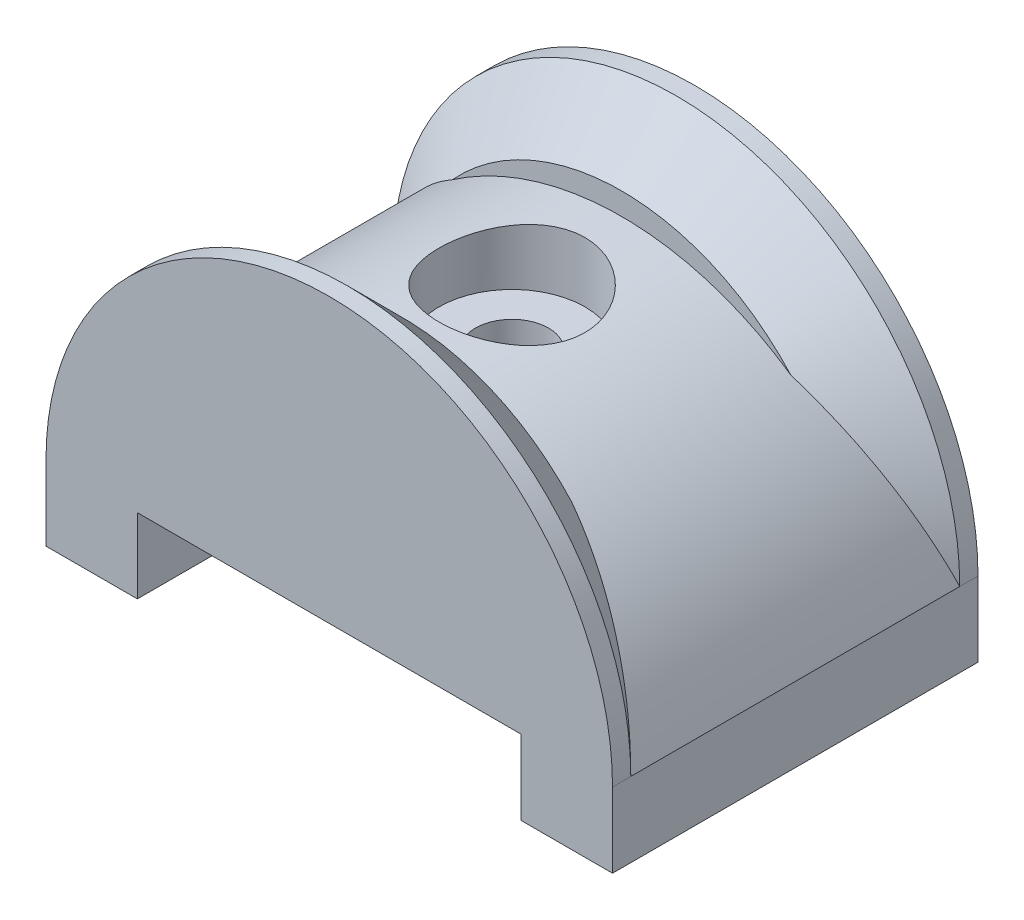
ISO-10303-21;
HEADER;
FILE_DESCRIPTION(('STEP AP214'),'2;1');
FILE_NAME('part.step','',(''),(''),'','','');
FILE_SCHEMA(('AUTOMOTIVE_DESIGN { 1 0 10303 214 1 1 1 1 }'));
ENDSEC;
DATA;
#1=APPLICATION_CONTEXT('core data for automotive mechanical design processes');
#2=APPLICATION_PROTOCOL_DEFINITION('international standard','automotive_design',2000,#1);
#3=PRODUCT_CONTEXT('',#1,'mechanical');
#4=PRODUCT('Part','Part','',(#3));
#5=PRODUCT_RELATED_PRODUCT_CATEGORY('part','',(#4));
#6=PRODUCT_DEFINITION_FORMATION('','',#4);
#7=PRODUCT_DEFINITION_CONTEXT('part definition',#1,'design');
#8=PRODUCT_DEFINITION('design','',#6,#7);
#9=PRODUCT_DEFINITION_SHAPE('','',#8);
#10=(LENGTH_UNIT() NAMED_UNIT(*) SI_UNIT(.MILLI.,.METRE.));
#11=(NAMED_UNIT(*) PLANE_ANGLE_UNIT() SI_UNIT($,.RADIAN.));
#12=(NAMED_UNIT(*) SI_UNIT($,.STERADIAN.) SOLID_ANGLE_UNIT());
#13=UNCERTAINTY_MEASURE_WITH_UNIT(LENGTH_MEASURE(1.E-05),#10,'distance_accuracy_value','');
#14=(GEOMETRIC_REPRESENTATION_CONTEXT(3) GLOBAL_UNCERTAINTY_ASSIGNED_CONTEXT((#13)) GLOBAL_UNIT_ASSIGNED_CONTEXT((#10,
#11,#12)) REPRESENTATION_CONTEXT('',''));
#15=CARTESIAN_POINT('',(0.,0.,0.));
#16=DIRECTION('',(0.,0.,1.));
#17=DIRECTION('',(1.,0.,0.));
#18=AXIS2_PLACEMENT_3D('',#15,#16,#17);
#19=CARTESIAN_POINT('',(1.09097462514418,0.,20.));
#20=DIRECTION('',(0.,0.,-1.));
#21=DIRECTION('',(-1.,0.,0.));
#22=AXIS2_PLACEMENT_3D('',#19,#20,#21);
#23=CYLINDRICAL_SURFACE('',#22,15.5);
#24=DIRECTION('',(0.,0.,-1.));
#25=VECTOR('',#24,1.);
#26=CARTESIAN_POINT('',(16.5909746251442,0.,20.));
#27=LINE('',#26,#25);
#28=CARTESIAN_POINT('',(16.5909746251442,0.,20.));
#29=VERTEX_POINT('',#28);
#30=CARTESIAN_POINT('',(16.5909746251442,0.,19.));
#31=VERTEX_POINT('',#30);
#32=EDGE_CURVE('E196',#29,#31,#27,.T.);
#33=ORIENTED_EDGE('',*,*,#32,.T.);
#34=CARTESIAN_POINT('',(1.09097462514418,0.,19.));
#35=DIRECTION('',(0.,0.,-1.));
#36=DIRECTION('',(-1.,0.,0.));
#37=AXIS2_PLACEMENT_3D('',#34,#35,#36);
#38=CIRCLE('',#37,15.5);
#39=CARTESIAN_POINT('',(-14.4090253748558,0.,19.));
#40=VERTEX_POINT('',#39);
#41=EDGE_CURVE('E138',#31,#40,#38,.F.);
#42=ORIENTED_EDGE('',*,*,#41,.T.);
#43=DIRECTION('',(0.,0.,-1.));
#44=VECTOR('',#43,1.);
#45=CARTESIAN_POINT('',(-14.4090253748558,0.,20.));
#46=LINE('',#45,#44);
#47=CARTESIAN_POINT('',(-14.4090253748558,0.,20.));
#48=VERTEX_POINT('',#47);
#49=EDGE_CURVE('E131',#48,#40,#46,.T.);
#50=ORIENTED_EDGE('',*,*,#49,.F.);
#51=CARTESIAN_POINT('',(1.09097462514418,0.,20.));
#52=DIRECTION('',(0.,0.,1.));
#53=DIRECTION('',(1.,0.,0.));
#54=AXIS2_PLACEMENT_3D('',#51,#52,#53);
#55=CIRCLE('',#54,15.5);
#56=EDGE_CURVE('E135',#48,#29,#55,.F.);
#57=ORIENTED_EDGE('',*,*,#56,.T.);
#58=EDGE_LOOP('',(#33,#42,#50,#57));
#59=FACE_BOUND('',#58,.T.);
#60=ADVANCED_FACE('F35',(#59),#23,.T.);
#61=CARTESIAN_POINT('',(-14.4090253748558,0.,0.999999999999997));
#62=VERTEX_POINT('',#61);
#63=CARTESIAN_POINT('',(-14.4090253748558,0.,0.));
#64=VERTEX_POINT('',#63);
#65=EDGE_CURVE('E144',#62,#64,#46,.T.);
#66=ORIENTED_EDGE('',*,*,#65,.F.);
#67=CARTESIAN_POINT('',(1.09097462514418,0.,0.999999999999997));
#68=DIRECTION('',(0.,0.,-1.));
#69=DIRECTION('',(-1.,0.,0.));
#70=AXIS2_PLACEMENT_3D('',#67,#68,#69);
#71=CIRCLE('',#70,15.5);
#72=CARTESIAN_POINT('',(16.5909746251442,0.,0.999999999999997));
#73=VERTEX_POINT('',#72);
#74=EDGE_CURVE('E214',#62,#73,#71,.T.);
#75=ORIENTED_EDGE('',*,*,#74,.T.);
#76=CARTESIAN_POINT('',(16.5909746251442,0.,0.));
#77=VERTEX_POINT('',#76);
#78=EDGE_CURVE('E177',#73,#77,#27,.T.);
#79=ORIENTED_EDGE('',*,*,#78,.T.);
#80=CARTESIAN_POINT('',(1.09097462514418,0.,0.));
#81=DIRECTION('',(0.,0.,1.));
#82=DIRECTION('',(1.,0.,0.));
#83=AXIS2_PLACEMENT_3D('',#80,#81,#82);
#84=CIRCLE('',#83,15.5);
#85=EDGE_CURVE('E178',#64,#77,#84,.F.);
#86=ORIENTED_EDGE('',*,*,#85,.F.);
#87=EDGE_LOOP('',(#66,#75,#79,#86));
#88=FACE_BOUND('',#87,.T.);
#89=ADVANCED_FACE('F239',(#88),#23,.T.);
#90=CARTESIAN_POINT('',(-14.4090253748558,0.,20.));
#91=DIRECTION('',(1.,0.,0.));
#92=DIRECTION('',(0.,0.,-1.));
#93=AXIS2_PLACEMENT_3D('',#90,#91,#92);
#94=PLANE('',#93);
#95=DIRECTION('',(0.,-1.,0.));
#96=VECTOR('',#95,1.);
#97=CARTESIAN_POINT('',(-14.4090253748558,0.,0.));
#98=LINE('',#97,#96);
#99=CARTESIAN_POINT('',(-14.4090253748558,-4.08823529411765,0.));
#100=VERTEX_POINT('',#99);
#101=EDGE_CURVE('E181',#64,#100,#98,.T.);
#102=ORIENTED_EDGE('',*,*,#101,.T.);
#103=DIRECTION('',(0.,0.,-1.));
#104=VECTOR('',#103,1.);
#105=CARTESIAN_POINT('',(-14.4090253748558,-4.08823529411765,20.));
#106=LINE('',#105,#104);
#107=CARTESIAN_POINT('',(-14.4090253748558,-4.08823529411765,20.));
#108=VERTEX_POINT('',#107);
#109=EDGE_CURVE('E149',#108,#100,#106,.T.);
#110=ORIENTED_EDGE('',*,*,#109,.F.);
#111=DIRECTION('',(0.,-1.,0.));
#112=VECTOR('',#111,1.);
#113=CARTESIAN_POINT('',(-14.4090253748558,0.,20.));
#114=LINE('',#113,#112);
#115=EDGE_CURVE('E146',#48,#108,#114,.T.);
#116=ORIENTED_EDGE('',*,*,#115,.F.);
#117=ORIENTED_EDGE('',*,*,#49,.T.);
#118=EDGE_CURVE('E142',#40,#62,#46,.T.);
#119=ORIENTED_EDGE('',*,*,#118,.T.);
#120=ORIENTED_EDGE('',*,*,#65,.T.);
#121=EDGE_LOOP('',(#102,#110,#116,#117,#119,#120));
#122=FACE_BOUND('',#121,.T.);
#123=ADVANCED_FACE('F147',(#122),#94,.F.);
#124=CARTESIAN_POINT('',(0.,-4.08823529411765,20.));
#125=DIRECTION('',(0.,1.,0.));
#126=DIRECTION('',(0.,0.,1.));
#127=AXIS2_PLACEMENT_3D('',#124,#125,#126);
#128=PLANE('',#127);
#129=DIRECTION('',(1.,0.,0.));
#130=VECTOR('',#129,1.);
#131=CARTESIAN_POINT('',(0.,-4.08823529411765,0.));
#132=LINE('',#131,#130);
#133=CARTESIAN_POINT('',(-9.40902537485582,-4.08823529411765,0.));
#134=VERTEX_POINT('',#133);
#135=EDGE_CURVE('E184',#100,#134,#132,.T.);
#136=ORIENTED_EDGE('',*,*,#135,.T.);
#137=DIRECTION('',(0.,0.,-1.));
#138=VECTOR('',#137,1.);
#139=CARTESIAN_POINT('',(-9.40902537485582,-4.08823529411765,20.));
#140=LINE('',#139,#138);
#141=CARTESIAN_POINT('',(-9.40902537485582,-4.08823529411765,20.));
#142=VERTEX_POINT('',#141);
#143=EDGE_CURVE('E209',#142,#134,#140,.T.);
#144=ORIENTED_EDGE('',*,*,#143,.F.);
#145=DIRECTION('',(1.,0.,0.));
#146=VECTOR('',#145,1.);
#147=CARTESIAN_POINT('',(0.,-4.08823529411765,20.));
#148=LINE('',#147,#146);
#149=EDGE_CURVE('E152',#108,#142,#148,.T.);
#150=ORIENTED_EDGE('',*,*,#149,.F.);
#151=ORIENTED_EDGE('',*,*,#109,.T.);
#152=EDGE_LOOP('',(#136,#144,#150,#151));
#153=FACE_BOUND('',#152,.T.);
#154=ADVANCED_FACE('F246',(#153),#128,.F.);
#155=CARTESIAN_POINT('',(-9.40902537485582,0.,20.));
#156=DIRECTION('',(1.,0.,0.));
#157=DIRECTION('',(0.,0.,-1.));
#158=AXIS2_PLACEMENT_3D('',#155,#156,#157);
#159=PLANE('',#158);
#160=DIRECTION('',(0.,-1.,0.));
#161=VECTOR('',#160,1.);
#162=CARTESIAN_POINT('',(-9.40902537485582,0.,0.));
#163=LINE('',#162,#161);
#164=CARTESIAN_POINT('',(-9.40902537485582,0.,0.));
#165=VERTEX_POINT('',#164);
#166=EDGE_CURVE('E187',#165,#134,#163,.T.);
#167=ORIENTED_EDGE('',*,*,#166,.F.);
#168=DIRECTION('',(0.,0.,-1.));
#169=VECTOR('',#168,1.);
#170=CARTESIAN_POINT('',(-9.40902537485582,0.,20.));
#171=LINE('',#170,#169);
#172=CARTESIAN_POINT('',(-9.40902537485582,0.,20.));
#173=VERTEX_POINT('',#172);
#174=EDGE_CURVE('E207',#173,#165,#171,.T.);
#175=ORIENTED_EDGE('',*,*,#174,.F.);
#176=DIRECTION('',(0.,-1.,0.));
#177=VECTOR('',#176,1.);
#178=CARTESIAN_POINT('',(-9.40902537485582,0.,20.));
#179=LINE('',#178,#177);
#180=EDGE_CURVE('E167',#173,#142,#179,.T.);
#181=ORIENTED_EDGE('',*,*,#180,.T.);
#182=ORIENTED_EDGE('',*,*,#143,.T.);
#183=EDGE_LOOP('',(#167,#175,#181,#182));
#184=FACE_BOUND('',#183,.T.);
#185=ADVANCED_FACE('F249',(#184),#159,.T.);
#186=CARTESIAN_POINT('',(0.,0.,20.));
#187=DIRECTION('',(0.,1.,0.));
#188=DIRECTION('',(0.,0.,1.));
#189=AXIS2_PLACEMENT_3D('',#186,#187,#188);
#190=PLANE('',#189);
#191=CARTESIAN_POINT('',(1.09097462514418,0.,10.));
#192=DIRECTION('',(0.,-1.,0.));
#193=DIRECTION('',(0.,0.,-1.));
#194=AXIS2_PLACEMENT_3D('',#191,#192,#193);
#195=CIRCLE('',#194,2.);
#196=CARTESIAN_POINT('',(1.09097462514418,0.,8.));
#197=VERTEX_POINT('',#196);
#198=EDGE_CURVE('E376',#197,#197,#195,.T.);
#199=ORIENTED_EDGE('',*,*,#198,.F.);
#200=EDGE_LOOP('',(#199));
#201=FACE_BOUND('',#200,.T.);
#202=DIRECTION('',(1.,0.,0.));
#203=VECTOR('',#202,1.);
#204=CARTESIAN_POINT('',(0.,0.,0.));
#205=LINE('',#204,#203);
#206=CARTESIAN_POINT('',(11.5909746251442,0.,0.));
#207=VERTEX_POINT('',#206);
#208=EDGE_CURVE('E190',#165,#207,#205,.T.);
#209=ORIENTED_EDGE('',*,*,#208,.T.);
#210=DIRECTION('',(0.,0.,-1.));
#211=VECTOR('',#210,1.);
#212=CARTESIAN_POINT('',(11.5909746251442,0.,20.));
#213=LINE('',#212,#211);
#214=CARTESIAN_POINT('',(11.5909746251442,0.,20.));
#215=VERTEX_POINT('',#214);
#216=EDGE_CURVE('E204',#215,#207,#213,.T.);
#217=ORIENTED_EDGE('',*,*,#216,.F.);
#218=DIRECTION('',(1.,0.,0.));
#219=VECTOR('',#218,1.);
#220=CARTESIAN_POINT('',(0.,0.,20.));
#221=LINE('',#220,#219);
#222=EDGE_CURVE('E170',#173,#215,#221,.T.);
#223=ORIENTED_EDGE('',*,*,#222,.F.);
#224=ORIENTED_EDGE('',*,*,#174,.T.);
#225=EDGE_LOOP('',(#209,#217,#223,#224));
#226=FACE_BOUND('',#225,.T.);
#227=ADVANCED_FACE('F253',(#201,#226),#190,.F.);
#228=CARTESIAN_POINT('',(11.5909746251442,0.,20.));
#229=DIRECTION('',(1.,0.,0.));
#230=DIRECTION('',(0.,0.,-1.));
#231=AXIS2_PLACEMENT_3D('',#228,#229,#230);
#232=PLANE('',#231);
#233=DIRECTION('',(0.,-1.,0.));
#234=VECTOR('',#233,1.);
#235=CARTESIAN_POINT('',(11.5909746251442,0.,0.));
#236=LINE('',#235,#234);
#237=CARTESIAN_POINT('',(11.5909746251442,-4.08823529411765,0.));
#238=VERTEX_POINT('',#237);
#239=EDGE_CURVE('E192',#207,#238,#236,.T.);
#240=ORIENTED_EDGE('',*,*,#239,.T.);
#241=DIRECTION('',(0.,0.,-1.));
#242=VECTOR('',#241,1.);
#243=CARTESIAN_POINT('',(11.5909746251442,-4.08823529411765,20.));
#244=LINE('',#243,#242);
#245=CARTESIAN_POINT('',(11.5909746251442,-4.08823529411765,20.));
#246=VERTEX_POINT('',#245);
#247=EDGE_CURVE('E201',#246,#238,#244,.T.);
#248=ORIENTED_EDGE('',*,*,#247,.F.);
#249=DIRECTION('',(0.,-1.,0.));
#250=VECTOR('',#249,1.);
#251=CARTESIAN_POINT('',(11.5909746251442,0.,20.));
#252=LINE('',#251,#250);
#253=EDGE_CURVE('E172',#215,#246,#252,.T.);
#254=ORIENTED_EDGE('',*,*,#253,.F.);
#255=ORIENTED_EDGE('',*,*,#216,.T.);
#256=EDGE_LOOP('',(#240,#248,#254,#255));
#257=FACE_BOUND('',#256,.T.);
#258=ADVANCED_FACE('F257',(#257),#232,.F.);
#259=CARTESIAN_POINT('',(0.,-4.08823529411765,20.));
#260=DIRECTION('',(0.,1.,0.));
#261=DIRECTION('',(0.,0.,1.));
#262=AXIS2_PLACEMENT_3D('',#259,#260,#261);
#263=PLANE('',#262);
#264=DIRECTION('',(1.,0.,0.));
#265=VECTOR('',#264,1.);
#266=CARTESIAN_POINT('',(0.,-4.08823529411765,0.));
#267=LINE('',#266,#265);
#268=CARTESIAN_POINT('',(16.5909746251442,-4.08823529411765,0.));
#269=VERTEX_POINT('',#268);
#270=EDGE_CURVE('E160',#238,#269,#267,.T.);
#271=ORIENTED_EDGE('',*,*,#270,.T.);
#272=DIRECTION('',(0.,0.,-1.));
#273=VECTOR('',#272,1.);
#274=CARTESIAN_POINT('',(16.5909746251442,-4.08823529411765,20.));
#275=LINE('',#274,#273);
#276=CARTESIAN_POINT('',(16.5909746251442,-4.08823529411765,20.));
#277=VERTEX_POINT('',#276);
#278=EDGE_CURVE('E198',#277,#269,#275,.T.);
#279=ORIENTED_EDGE('',*,*,#278,.F.);
#280=DIRECTION('',(1.,0.,0.));
#281=VECTOR('',#280,1.);
#282=CARTESIAN_POINT('',(0.,-4.08823529411765,20.));
#283=LINE('',#282,#281);
#284=EDGE_CURVE('E174',#246,#277,#283,.T.);
#285=ORIENTED_EDGE('',*,*,#284,.F.);
#286=ORIENTED_EDGE('',*,*,#247,.T.);
#287=EDGE_LOOP('',(#271,#279,#285,#286));
#288=FACE_BOUND('',#287,.T.);
#289=ADVANCED_FACE('F261',(#288),#263,.F.);
#290=CARTESIAN_POINT('',(16.5909746251442,0.,20.));
#291=DIRECTION('',(1.,0.,0.));
#292=DIRECTION('',(0.,0.,-1.));
#293=AXIS2_PLACEMENT_3D('',#290,#291,#292);
#294=PLANE('',#293);
#295=DIRECTION('',(0.,-1.,0.));
#296=VECTOR('',#295,1.);
#297=CARTESIAN_POINT('',(16.5909746251442,0.,0.));
#298=LINE('',#297,#296);
#299=EDGE_CURVE('E157',#77,#269,#298,.T.);
#300=ORIENTED_EDGE('',*,*,#299,.F.);
#301=ORIENTED_EDGE('',*,*,#78,.F.);
#302=EDGE_CURVE('E199',#31,#73,#27,.T.);
#303=ORIENTED_EDGE('',*,*,#302,.F.);
#304=ORIENTED_EDGE('',*,*,#32,.F.);
#305=DIRECTION('',(0.,-1.,0.));
#306=VECTOR('',#305,1.);
#307=CARTESIAN_POINT('',(16.5909746251442,0.,20.));
#308=LINE('',#307,#306);
#309=EDGE_CURVE('E156',#29,#277,#308,.T.);
#310=ORIENTED_EDGE('',*,*,#309,.T.);
#311=ORIENTED_EDGE('',*,*,#278,.T.);
#312=EDGE_LOOP('',(#300,#301,#303,#304,#310,#311));
#313=FACE_BOUND('',#312,.T.);
#314=ADVANCED_FACE('F265',(#313),#294,.T.);
#315=CARTESIAN_POINT('',(0.,0.,20.));
#316=DIRECTION('',(0.,0.,1.));
#317=DIRECTION('',(1.,0.,0.));
#318=AXIS2_PLACEMENT_3D('',#315,#316,#317);
#319=PLANE('',#318);
#320=ORIENTED_EDGE('',*,*,#56,.F.);
#321=ORIENTED_EDGE('',*,*,#115,.T.);
#322=ORIENTED_EDGE('',*,*,#149,.T.);
#323=ORIENTED_EDGE('',*,*,#180,.F.);
#324=ORIENTED_EDGE('',*,*,#222,.T.);
#325=ORIENTED_EDGE('',*,*,#253,.T.);
#326=ORIENTED_EDGE('',*,*,#284,.T.);
#327=ORIENTED_EDGE('',*,*,#309,.F.);
#328=EDGE_LOOP('',(#320,#321,#322,#323,#324,#325,#326,#327));
#329=FACE_BOUND('',#328,.T.);
#330=ADVANCED_FACE('F154',(#329),#319,.T.);
#331=CARTESIAN_POINT('',(0.,0.,0.));
#332=DIRECTION('',(0.,0.,1.));
#333=DIRECTION('',(1.,0.,0.));
#334=AXIS2_PLACEMENT_3D('',#331,#332,#333);
#335=PLANE('',#334);
#336=ORIENTED_EDGE('',*,*,#85,.T.);
#337=ORIENTED_EDGE('',*,*,#299,.T.);
#338=ORIENTED_EDGE('',*,*,#270,.F.);
#339=ORIENTED_EDGE('',*,*,#239,.F.);
#340=ORIENTED_EDGE('',*,*,#208,.F.);
#341=ORIENTED_EDGE('',*,*,#166,.T.);
#342=ORIENTED_EDGE('',*,*,#135,.F.);
#343=ORIENTED_EDGE('',*,*,#101,.F.);
#344=EDGE_LOOP('',(#336,#337,#338,#339,#340,#341,#342,#343));
#345=FACE_BOUND('',#344,.T.);
#346=ADVANCED_FACE('F270',(#345),#335,.F.);
#347=CARTESIAN_POINT('',(1.09097462514418,-5.,4.));
#348=DIRECTION('',(0.,0.,1.));
#349=DIRECTION('',(1.,0.,0.));
#350=AXIS2_PLACEMENT_3D('',#347,#348,#349);
#351=CYLINDRICAL_SURFACE('',#350,16.2864974749023);
#352=CARTESIAN_POINT('',(1.09097462514418,11.2864974749023,6.));
#353=CARTESIAN_POINT('',(1.31210299059034,11.2864936573694,6.00000642769515));
#354=CARTESIAN_POINT('',(1.53330396261911,11.281948947198,6.01839838400324));
#355=CARTESIAN_POINT('',(1.96937460305155,11.2642593448246,6.09137512151017));
#356=CARTESIAN_POINT('',(2.18424046708558,11.2511093906575,6.14598120563046));
#357=CARTESIAN_POINT('',(2.60127996222932,11.2176666429046,6.28953486045588));
#358=CARTESIAN_POINT('',(2.80346822076669,11.1973822666106,6.37844197425101));
#359=CARTESIAN_POINT('',(3.1900591285659,11.1518352262408,6.58793361184587));
#360=CARTESIAN_POINT('',(3.3744613303793,11.1265724369705,6.70851893229838));
#361=CARTESIAN_POINT('',(3.72392150012753,11.0732519739871,6.98048303540672));
#362=CARTESIAN_POINT('',(3.88857448559456,11.0451523927953,7.13237401316733));
#363=CARTESIAN_POINT('',(4.19034368309164,10.9896061922319,7.46154075100247));
#364=CARTESIAN_POINT('',(4.32745689004656,10.9621596444055,7.63881927769451));
#365=CARTESIAN_POINT('',(4.57214149369925,10.9106060778117,8.01685109307522));
#366=CARTESIAN_POINT('',(4.67926311212242,10.886552339608,8.21790342972499));
#367=CARTESIAN_POINT('',(4.85803240880121,10.8451176653597,8.63584781256897));
#368=CARTESIAN_POINT('',(4.92968554169898,10.8277357033656,8.85273741728396));
#369=CARTESIAN_POINT('',(5.03410867786257,10.8020428108752,9.29175498807178));
#370=CARTESIAN_POINT('',(5.06760525042444,10.793562629383,9.51370000229811));
#371=CARTESIAN_POINT('',(5.09702701303195,10.7861266012832,9.96020883043366));
#372=CARTESIAN_POINT('',(5.09295808949094,10.7871692624712,10.1847722285414));
#373=CARTESIAN_POINT('',(5.04794479576095,10.7985088036871,10.6246000536363));
#374=CARTESIAN_POINT('',(5.00786291712845,10.8085892221283,10.8399591991226));
#375=CARTESIAN_POINT('',(4.89333595606139,10.8365239132786,11.2607990593982));
#376=CARTESIAN_POINT('',(4.81888850181322,10.854378722549,11.4662790912784));
#377=CARTESIAN_POINT('',(4.63700035718128,10.896051235033,11.8638571290479));
#378=CARTESIAN_POINT('',(4.52924391419897,10.9199255830817,12.0558044947826));
#379=CARTESIAN_POINT('',(4.28401759313177,10.9709147594387,12.4192036342999));
#380=CARTESIAN_POINT('',(4.14654268305992,10.9980301361759,12.5906519294965));
#381=CARTESIAN_POINT('',(3.84129966916708,11.0533601617304,12.9131323155543));
#382=CARTESIAN_POINT('',(3.67280287070092,11.0815845414639,13.0634738317417));
#383=CARTESIAN_POINT('',(3.31265287090881,11.1352794492222,13.3338947982388));
#384=CARTESIAN_POINT('',(3.1209990101808,11.1607498987891,13.4539733865049));
#385=CARTESIAN_POINT('',(2.71901111270204,11.2061867918151,13.6607009629717));
#386=CARTESIAN_POINT('',(2.50861888463329,11.2261352390937,13.7472410073633));
#387=CARTESIAN_POINT('',(2.07567474623791,11.2581492921995,13.8835349351829));
#388=CARTESIAN_POINT('',(1.85312508662274,11.2702163517888,13.9332956029768));
#389=CARTESIAN_POINT('',(1.40809055622861,11.2848940760782,13.9935710805179));
#390=CARTESIAN_POINT('',(1.18574040193758,11.2877313902224,14.0050267250438));
#391=CARTESIAN_POINT('',(0.742300756575789,11.284273931568,13.9909429273724));
#392=CARTESIAN_POINT('',(0.521211157902396,11.2779799503096,13.9654066917916));
#393=CARTESIAN_POINT('',(0.089815385223967,11.2571120303185,13.8788403323974));
#394=CARTESIAN_POINT('',(-0.120599479297499,11.2426572114496,13.818320549933));
#395=CARTESIAN_POINT('',(-0.528281466688252,11.2070947200359,13.6640855071114));
#396=CARTESIAN_POINT('',(-0.7255472868402,11.1859863894901,13.5703669634388));
#397=CARTESIAN_POINT('',(-1.10509676580449,11.1389127906749,13.3505512674229));
#398=CARTESIAN_POINT('',(-1.28706317677569,11.1128700010697,13.2239233285517));
#399=CARTESIAN_POINT('',(-1.62749861719341,11.0589433640744,12.9425647465928));
#400=CARTESIAN_POINT('',(-1.78596373259763,11.0310592111282,12.7878294318653));
#401=CARTESIAN_POINT('',(-2.07875264626141,10.97578144922,12.4502867820388));
#402=CARTESIAN_POINT('',(-2.21241758925323,10.9484149966875,12.2669025630319));
#403=CARTESIAN_POINT('',(-2.44707200200855,10.8980088936568,11.8797484444896));
#404=CARTESIAN_POINT('',(-2.54806293103331,10.8749690499463,11.6759794558952));
#405=CARTESIAN_POINT('',(-2.71375680795472,10.8360748134923,11.2549427923693));
#406=CARTESIAN_POINT('',(-2.77867466288223,10.8201779769837,11.0377638157514));
#407=CARTESIAN_POINT('',(-2.87095762472804,10.7973224080435,10.5951264515017));
#408=CARTESIAN_POINT('',(-2.89833060439454,10.7903618018022,10.3696698097893));
#409=CARTESIAN_POINT('',(-2.91434634113649,10.7863060512327,9.92357176836835));
#410=CARTESIAN_POINT('',(-2.90404077160972,10.7889430128164,9.70296994599479));
#411=CARTESIAN_POINT('',(-2.84739060316353,10.8031678989052,9.26675249047051));
#412=CARTESIAN_POINT('',(-2.80104668023341,10.814755655516,9.05113676387123));
#413=CARTESIAN_POINT('',(-2.67420036772951,10.8454298379215,8.63210986614168));
#414=CARTESIAN_POINT('',(-2.59388871383837,10.8644743488541,8.42863767801896));
#415=CARTESIAN_POINT('',(-2.40153879099471,10.9079234667149,8.03791316862922));
#416=CARTESIAN_POINT('',(-2.28949627534164,10.9323287910094,7.85066302282312));
#417=CARTESIAN_POINT('',(-2.0335398908913,10.9845190003636,7.49260048900457));
#418=CARTESIAN_POINT('',(-1.88889329756328,11.0123736108308,7.32232195239417));
#419=CARTESIAN_POINT('',(-1.5732712733439,11.0679003772524,7.00811199921088));
#420=CARTESIAN_POINT('',(-1.40228963114769,11.0955724885532,6.86418681583417));
#421=CARTESIAN_POINT('',(-1.03527897917018,11.1481875810438,6.6043455404413));
#422=CARTESIAN_POINT('',(-0.838867623692891,11.1730750278789,6.48895742483692));
#423=CARTESIAN_POINT('',(-0.428844723211175,11.2167356400709,6.29302103454379));
#424=CARTESIAN_POINT('',(-0.215245959878213,11.2355132975957,6.2124471486456));
#425=CARTESIAN_POINT('',(0.180218586870806,11.2619758998365,6.10074850447857));
#426=CARTESIAN_POINT('',(0.360158808290088,11.2711092735763,6.06304799855444));
#427=CARTESIAN_POINT('',(0.723707704739067,11.2833714365118,6.01267195194779));
#428=CARTESIAN_POINT('',(0.907316122355947,11.2865006455602,5.99999466146794));
#429=CARTESIAN_POINT('',(1.09097462514418,11.2864974749023,6.));
#430=B_SPLINE_CURVE_WITH_KNOTS('',3,(#352,#353,#354,#355,#356,#357,#358,#359,#360,#361,#362,
#363,#364,#365,#366,#367,#368,#369,#370,#371,#372,#373,#374,#375,#376,#377,#378,#379,#380,#381,
#382,#383,#384,#385,#386,#387,#388,#389,#390,#391,#392,#393,#394,#395,#396,#397,#398,#399,#400,
#401,#402,#403,#404,#405,#406,#407,#408,#409,#410,#411,#412,#413,#414,#415,#416,#417,#418,#419,
#420,#421,#422,#423,#424,#425,#426,#427,#428,#429),.UNSPECIFIED.,.T.,.F.,(4,2,2,2,2,2,2,2,2,2,2,
2,2,2,2,2,2,2,2,2,2,2,2,2,2,2,2,2,2,2,2,2,2,2,2,2,2,2,4),(0.,0.662712174115542,1.32581453414827,
1.98813716654645,2.65047645682233,3.32466233685364,3.9989217425267,4.68280879297519,
5.36659063681764,6.03712218914278,6.70754867274023,7.36233459997557,8.01716572541878,
8.67840524232565,9.33975680937534,10.0192838275023,10.6988301998615,11.3805658136984,
12.0621756423974,12.7269159741549,13.3915986867897,14.0468212685595,14.7021086691097,
15.3687029846885,16.0354081943848,16.7178658077078,17.4002929374338,18.078609650539,
18.7567841063194,19.4161758769781,20.0755552793961,20.7312802858398,21.3870930927599,
22.059450337826,22.7319664065598,23.4161240109634,24.0997774519538,24.6502325567492,
25.2006491685304),.UNSPECIFIED.);
#431=CARTESIAN_POINT('',(1.09097462514418,11.2864974749023,6.));
#432=VERTEX_POINT('',#431);
#433=EDGE_CURVE('E40',#432,#432,#430,.T.);
#434=ORIENTED_EDGE('',*,*,#433,.T.);
#435=EDGE_LOOP('',(#434));
#436=FACE_BOUND('',#435,.T.);
#437=ORIENTED_EDGE('',*,*,#118,.F.);
#438=CARTESIAN_POINT('',(-14.4090253748558,0.,19.));
#439=CARTESIAN_POINT('',(-14.2605686167593,0.460346662734435,18.8515259006066));
#440=CARTESIAN_POINT('',(-14.091530371159,0.914053080136463,18.7030116406465));
#441=CARTESIAN_POINT('',(-13.7136074117672,1.80501179023407,18.4070979985834));
#442=CARTESIAN_POINT('',(-13.5047172970736,2.2422618430625,18.2596987704128));
#443=CARTESIAN_POINT('',(-13.0544767572992,3.08571386887647,17.9711154121832));
#444=CARTESIAN_POINT('',(-12.8141299978147,3.49243097106223,17.8298699755568));
#445=CARTESIAN_POINT('',(-12.2984300629513,4.28423242494673,17.5508758229885));
#446=CARTESIAN_POINT('',(-12.0230828391377,4.66932043849469,17.4131265173222));
#447=CARTESIAN_POINT('',(-11.4829139831454,5.35902141889731,17.1628335122673));
#448=CARTESIAN_POINT('',(-11.2227283674657,5.66703164052792,17.0496127073072));
#449=CARTESIAN_POINT('',(-10.6793793887287,6.2637275372303,16.8276047164522));
#450=CARTESIAN_POINT('',(-10.3962190689987,6.55241576256069,16.7188169461972));
#451=CARTESIAN_POINT('',(-9.80133740540696,7.1152374292125,16.5042061626969));
#452=CARTESIAN_POINT('',(-9.48910900895904,7.38888350041228,16.3985088572511));
#453=CARTESIAN_POINT('',(-8.84320861699403,7.91259579796913,16.1938809118851));
#454=CARTESIAN_POINT('',(-8.50952949164829,8.16265411533636,16.0949525446264));
#455=CARTESIAN_POINT('',(-8.16591470119002,8.4,16.));
#456=B_SPLINE_CURVE_WITH_KNOTS('',3,(#438,#439,#440,#441,#442,#443,#444,#445,#446,#447,#448,
#449,#450,#451,#452,#453,#454,#455),.UNSPECIFIED.,.F.,.F.,(4,2,2,2,2,2,2,2,4),(0.,
1.5174645921658,3.03513498414491,4.51269961113276,5.99001332464109,7.24532985015483,
8.50048036172321,9.78449455578738,11.0689377616094),.UNSPECIFIED.);
#457=CARTESIAN_POINT('',(-8.16591470119001,8.4,16.));
#458=VERTEX_POINT('',#457);
#459=EDGE_CURVE('E49',#40,#458,#456,.T.);
#460=ORIENTED_EDGE('',*,*,#459,.T.);
#461=CARTESIAN_POINT('',(1.09097462514418,-5.,16.));
#462=DIRECTION('',(0.,0.,-1.));
#463=DIRECTION('',(-1.,0.,0.));
#464=AXIS2_PLACEMENT_3D('',#461,#462,#463);
#465=CIRCLE('',#464,16.2864974749023);
#466=CARTESIAN_POINT('',(10.3478639514784,8.4,16.));
#467=VERTEX_POINT('',#466);
#468=EDGE_CURVE('E163',#458,#467,#465,.T.);
#469=ORIENTED_EDGE('',*,*,#468,.T.);
#470=CARTESIAN_POINT('',(10.3478639514784,8.4,16.));
#471=CARTESIAN_POINT('',(10.7355094977273,8.13225452055163,16.1071217242092));
#472=CARTESIAN_POINT('',(11.1104937876465,7.84832332156453,16.2192957215362));
#473=CARTESIAN_POINT('',(11.8329478765707,7.25068926769202,16.4520842236244));
#474=CARTESIAN_POINT('',(12.1804253695153,6.93699479226623,16.5726963502445));
#475=CARTESIAN_POINT('',(12.8375254712092,6.29051397499144,16.8176396095829));
#476=CARTESIAN_POINT('',(13.1478803504608,5.95840622522696,16.9418009158134));
#477=CARTESIAN_POINT('',(13.7389193009307,5.27059202386964,17.1952592605358));
#478=CARTESIAN_POINT('',(14.0196036314595,4.91488577856384,17.3245562541298));
#479=CARTESIAN_POINT('',(14.532668775072,4.20596422882233,17.5785451969813));
#480=CARTESIAN_POINT('',(14.7669978393666,3.85406949101613,17.7029958727082));
#481=CARTESIAN_POINT('',(15.2072614712784,3.13379386812767,17.9543370948925));
#482=CARTESIAN_POINT('',(15.4131970488131,2.76541357003186,18.081227554387));
#483=CARTESIAN_POINT('',(15.8003038061409,2.00513525488412,18.3396669171983));
#484=CARTESIAN_POINT('',(15.9807555396375,1.61288392206052,18.471254262188));
#485=CARTESIAN_POINT('',(16.3099121410111,0.815513983878288,18.7352358001143));
#486=CARTESIAN_POINT('',(16.4586152113681,0.410394651460595,18.8676300382985));
#487=CARTESIAN_POINT('',(16.5909746251442,0.,19.));
#488=B_SPLINE_CURVE_WITH_KNOTS('',3,(#470,#471,#472,#473,#474,#475,#476,#477,#478,#479,#480,
#481,#482,#483,#484,#485,#486,#487),.UNSPECIFIED.,.F.,.F.,(4,2,2,2,2,2,2,2,4),(0.,
1.44888850002759,2.89737028813809,4.30942222633298,5.72146182265504,7.04237914641719,
8.36324947483191,9.71606751269391,11.0689621230143),.UNSPECIFIED.);
#489=EDGE_CURVE('E11',#467,#31,#488,.T.);
#490=ORIENTED_EDGE('',*,*,#489,.T.);
#491=ORIENTED_EDGE('',*,*,#302,.T.);
#492=CARTESIAN_POINT('',(16.5909746251442,0.,0.999999999999997));
#493=CARTESIAN_POINT('',(16.4425178670477,0.460346662734439,1.14847409939336));
#494=CARTESIAN_POINT('',(16.2734796214473,0.914053080136468,1.29698835935353));
#495=CARTESIAN_POINT('',(15.8955566620555,1.80501179023407,1.59290200141661));
#496=CARTESIAN_POINT('',(15.6866665473619,2.24226184306251,1.74030122958724));
#497=CARTESIAN_POINT('',(15.2364260075875,3.08571386887647,2.02888458781684));
#498=CARTESIAN_POINT('',(14.9960792481031,3.49243097106223,2.17013002444325));
#499=CARTESIAN_POINT('',(14.4803793132396,4.28423242494673,2.44912417701151));
#500=CARTESIAN_POINT('',(14.205032089426,4.6693204384947,2.58687348267784));
#501=CARTESIAN_POINT('',(13.6648632334337,5.35902141889731,2.83716648773271));
#502=CARTESIAN_POINT('',(13.404677617754,5.66703164052792,2.95038729269279));
#503=CARTESIAN_POINT('',(12.8613286390171,6.26372753723029,3.17239528354779));
#504=CARTESIAN_POINT('',(12.578168319287,6.55241576256068,3.28118305380276));
#505=CARTESIAN_POINT('',(11.9832866556953,7.11523742921248,3.49579383730306));
#506=CARTESIAN_POINT('',(11.6710582592474,7.38888350041225,3.60149114274887));
#507=CARTESIAN_POINT('',(11.0251578672824,7.9125957979691,3.80611908811493));
#508=CARTESIAN_POINT('',(10.6914787419367,8.16265411533633,3.90504745537356));
#509=CARTESIAN_POINT('',(10.3478639514784,8.39999999999997,4.));
#510=B_SPLINE_CURVE_WITH_KNOTS('',3,(#492,#493,#494,#495,#496,#497,#498,#499,#500,#501,#502,
#503,#504,#505,#506,#507,#508,#509),.UNSPECIFIED.,.F.,.F.,(4,2,2,2,2,2,2,2,4),(0.,
1.51746459216581,3.03513498414491,4.51269961113277,5.9900133246411,7.24532985015482,
8.50048036172319,9.78449455578734,11.0689377616093),.UNSPECIFIED.);
#511=CARTESIAN_POINT('',(10.3478639514784,8.39999999999997,4.));
#512=VERTEX_POINT('',#511);
#513=EDGE_CURVE('E224',#73,#512,#510,.T.);
#514=ORIENTED_EDGE('',*,*,#513,.T.);
#515=CARTESIAN_POINT('',(1.09097462514418,-5.,4.));
#516=DIRECTION('',(0.,0.,-1.));
#517=DIRECTION('',(-1.,0.,0.));
#518=AXIS2_PLACEMENT_3D('',#515,#516,#517);
#519=CIRCLE('',#518,16.2864974749023);
#520=CARTESIAN_POINT('',(-8.16591470119006,8.39999999999997,4.));
#521=VERTEX_POINT('',#520);
#522=EDGE_CURVE('E182',#521,#512,#519,.T.);
#523=ORIENTED_EDGE('',*,*,#522,.F.);
#524=CARTESIAN_POINT('',(-8.16591470119007,8.39999999999997,4.));
#525=CARTESIAN_POINT('',(-8.55356024743901,8.13225452055159,3.89287827579078));
#526=CARTESIAN_POINT('',(-8.92854453735821,7.8483233215645,3.7807042784638));
#527=CARTESIAN_POINT('',(-9.65099862628238,7.25068926769198,3.54791577637555));
#528=CARTESIAN_POINT('',(-9.99847611922702,6.93699479226618,3.42730364975551));
#529=CARTESIAN_POINT('',(-10.6555762209209,6.29051397499139,3.18236039041714));
#530=CARTESIAN_POINT('',(-10.9659311001724,5.9584062252269,3.05819908418658));
#531=CARTESIAN_POINT('',(-11.5569700506424,5.27059202386958,2.80474073946424));
#532=CARTESIAN_POINT('',(-11.8376543811712,4.91488577856378,2.6754437458702));
#533=CARTESIAN_POINT('',(-12.3507195247837,4.20596422882227,2.42145480301873));
#534=CARTESIAN_POINT('',(-12.5850485890783,3.85406949101608,2.29700412729178));
#535=CARTESIAN_POINT('',(-13.0253122209901,3.13379386812763,2.04566290510749));
#536=CARTESIAN_POINT('',(-13.2312477985248,2.76541357003182,1.91877244561295));
#537=CARTESIAN_POINT('',(-13.6183545558525,2.00513525488409,1.66033308280169));
#538=CARTESIAN_POINT('',(-13.7988062893491,1.6128839220605,1.52874573781194));
#539=CARTESIAN_POINT('',(-14.1279628907228,0.815513983878272,1.26476419988572));
#540=CARTESIAN_POINT('',(-14.2766659610797,0.410394651460585,1.13236996170147));
#541=CARTESIAN_POINT('',(-14.4090253748558,0.,1.));
#542=B_SPLINE_CURVE_WITH_KNOTS('',3,(#524,#525,#526,#527,#528,#529,#530,#531,#532,#533,#534,
#535,#536,#537,#538,#539,#540,#541),.UNSPECIFIED.,.F.,.F.,(4,2,2,2,2,2,2,2,4),(0.,
1.44888850002759,2.8973702881381,4.30942222633299,5.72146182265505,7.04237914641719,
8.3632494748319,9.71606751269388,11.0689621230143),.UNSPECIFIED.);
#543=EDGE_CURVE('E219',#521,#62,#542,.T.);
#544=ORIENTED_EDGE('',*,*,#543,.T.);
#545=EDGE_LOOP('',(#437,#460,#469,#490,#491,#514,#523,#544));
#546=FACE_BOUND('',#545,.T.);
#547=ADVANCED_FACE('F229',(#436,#546),#351,.T.);
#548=CARTESIAN_POINT('',(1.09097462514418,-2.5,4.));
#549=DIRECTION('',(0.,0.,-1.));
#550=DIRECTION('',(-1.,0.,0.));
#551=AXIS2_PLACEMENT_3D('',#548,#549,#550);
#552=PLANE('',#551);
#553=ORIENTED_EDGE('',*,*,#522,.T.);
#554=CARTESIAN_POINT('',(1.09097462514418,0.,4.));
#555=DIRECTION('',(0.,0.,-1.));
#556=DIRECTION('',(-1.,0.,0.));
#557=AXIS2_PLACEMENT_3D('',#554,#555,#556);
#558=CIRCLE('',#557,12.5);
#559=EDGE_CURVE('E141',#512,#521,#558,.F.);
#560=ORIENTED_EDGE('',*,*,#559,.T.);
#561=EDGE_LOOP('',(#553,#560));
#562=FACE_BOUND('',#561,.T.);
#563=ADVANCED_FACE('F299',(#562),#552,.F.);
#564=CARTESIAN_POINT('',(1.09097462514418,-2.5,16.));
#565=DIRECTION('',(0.,0.,-1.));
#566=DIRECTION('',(-1.,0.,0.));
#567=AXIS2_PLACEMENT_3D('',#564,#565,#566);
#568=PLANE('',#567);
#569=ORIENTED_EDGE('',*,*,#468,.F.);
#570=CARTESIAN_POINT('',(1.09097462514418,0.,16.));
#571=DIRECTION('',(0.,0.,-1.));
#572=DIRECTION('',(-1.,0.,0.));
#573=AXIS2_PLACEMENT_3D('',#570,#571,#572);
#574=CIRCLE('',#573,12.5);
#575=EDGE_CURVE('E56',#458,#467,#574,.T.);
#576=ORIENTED_EDGE('',*,*,#575,.T.);
#577=EDGE_LOOP('',(#569,#576));
#578=FACE_BOUND('',#577,.T.);
#579=ADVANCED_FACE('F237',(#578),#568,.T.);
#580=CARTESIAN_POINT('',(1.09097462514418,0.,4.));
#581=DIRECTION('',(0.,0.,-1.));
#582=DIRECTION('',(-1.,0.,0.));
#583=AXIS2_PLACEMENT_3D('',#580,#581,#582);
#584=CONICAL_SURFACE('',#583,12.5,0.785398163397446);
#585=ORIENTED_EDGE('',*,*,#513,.F.);
#586=ORIENTED_EDGE('',*,*,#74,.F.);
#587=ORIENTED_EDGE('',*,*,#543,.F.);
#588=ORIENTED_EDGE('',*,*,#559,.F.);
#589=EDGE_LOOP('',(#585,#586,#587,#588));
#590=FACE_BOUND('',#589,.T.);
#591=ADVANCED_FACE('F233',(#590),#584,.T.);
#592=CARTESIAN_POINT('',(1.09097462514418,0.,19.));
#593=DIRECTION('',(0.,0.,1.));
#594=DIRECTION('',(1.,0.,0.));
#595=AXIS2_PLACEMENT_3D('',#592,#593,#594);
#596=CONICAL_SURFACE('',#595,15.5,0.78539816339745);
#597=ORIENTED_EDGE('',*,*,#489,.F.);
#598=ORIENTED_EDGE('',*,*,#575,.F.);
#599=ORIENTED_EDGE('',*,*,#459,.F.);
#600=ORIENTED_EDGE('',*,*,#41,.F.);
#601=EDGE_LOOP('',(#597,#598,#599,#600));
#602=FACE_BOUND('',#601,.T.);
#603=ADVANCED_FACE('F37',(#602),#596,.T.);
#604=CARTESIAN_POINT('',(1.09097462514418,12.,10.));
#605=DIRECTION('',(0.,-1.,0.));
#606=DIRECTION('',(0.,0.,-1.));
#607=AXIS2_PLACEMENT_3D('',#604,#605,#606);
#608=CYLINDRICAL_SURFACE('',#607,2.);
#609=CARTESIAN_POINT('',(1.09097462514418,8.,10.));
#610=DIRECTION('',(0.,-1.,0.));
#611=DIRECTION('',(0.,0.,-1.));
#612=AXIS2_PLACEMENT_3D('',#609,#610,#611);
#613=CIRCLE('',#612,2.);
#614=CARTESIAN_POINT('',(1.09097462514418,8.,8.));
#615=VERTEX_POINT('',#614);
#616=EDGE_CURVE('E374',#615,#615,#613,.F.);
#617=ORIENTED_EDGE('',*,*,#616,.T.);
#618=EDGE_LOOP('',(#617));
#619=FACE_BOUND('',#618,.T.);
#620=ORIENTED_EDGE('',*,*,#198,.T.);
#621=EDGE_LOOP('',(#620));
#622=FACE_BOUND('',#621,.T.);
#623=ADVANCED_FACE('F326',(#619,#622),#608,.F.);
#624=CARTESIAN_POINT('',(1.09097462514418,20.,10.));
#625=DIRECTION('',(0.,-1.,0.));
#626=DIRECTION('',(0.,0.,-1.));
#627=AXIS2_PLACEMENT_3D('',#624,#625,#626);
#628=CYLINDRICAL_SURFACE('',#627,4.);
#629=CARTESIAN_POINT('',(1.09097462514418,8.,10.));
#630=DIRECTION('',(0.,-1.,0.));
#631=DIRECTION('',(0.,0.,-1.));
#632=AXIS2_PLACEMENT_3D('',#629,#630,#631);
#633=CIRCLE('',#632,4.);
#634=CARTESIAN_POINT('',(1.09097462514418,8.,6.));
#635=VERTEX_POINT('',#634);
#636=EDGE_CURVE('E371',#635,#635,#633,.T.);
#637=ORIENTED_EDGE('',*,*,#636,.T.);
#638=EDGE_LOOP('',(#637));
#639=FACE_BOUND('',#638,.T.);
#640=ORIENTED_EDGE('',*,*,#433,.F.);
#641=EDGE_LOOP('',(#640));
#642=FACE_BOUND('',#641,.T.);
#643=ADVANCED_FACE('F344',(#639,#642),#628,.F.);
#644=CARTESIAN_POINT('',(1.09097462514418,8.,10.));
#645=DIRECTION('',(0.,-1.,0.));
#646=DIRECTION('',(0.,0.,-1.));
#647=AXIS2_PLACEMENT_3D('',#644,#645,#646);
#648=PLANE('',#647);
#649=ORIENTED_EDGE('',*,*,#636,.F.);
#650=EDGE_LOOP('',(#649));
#651=FACE_BOUND('',#650,.T.);
#652=ORIENTED_EDGE('',*,*,#616,.F.);
#653=EDGE_LOOP('',(#652));
#654=FACE_BOUND('',#653,.T.);
#655=ADVANCED_FACE('F354',(#651,#654),#648,.F.);
#656=CLOSED_SHELL('',(#60,#89,#123,#154,#185,#227,#258,#289,#314,#330,#346,#547,#563,#579,#591,
#603,#623,#643,#655));
#657=MANIFOLD_SOLID_BREP('B2',#656);
#658=ADVANCED_BREP_SHAPE_REPRESENTATION('',(#18,#657),#14);
#659=SHAPE_DEFINITION_REPRESENTATION(#9,#658);
ENDSEC;
END-ISO-10303-21;
